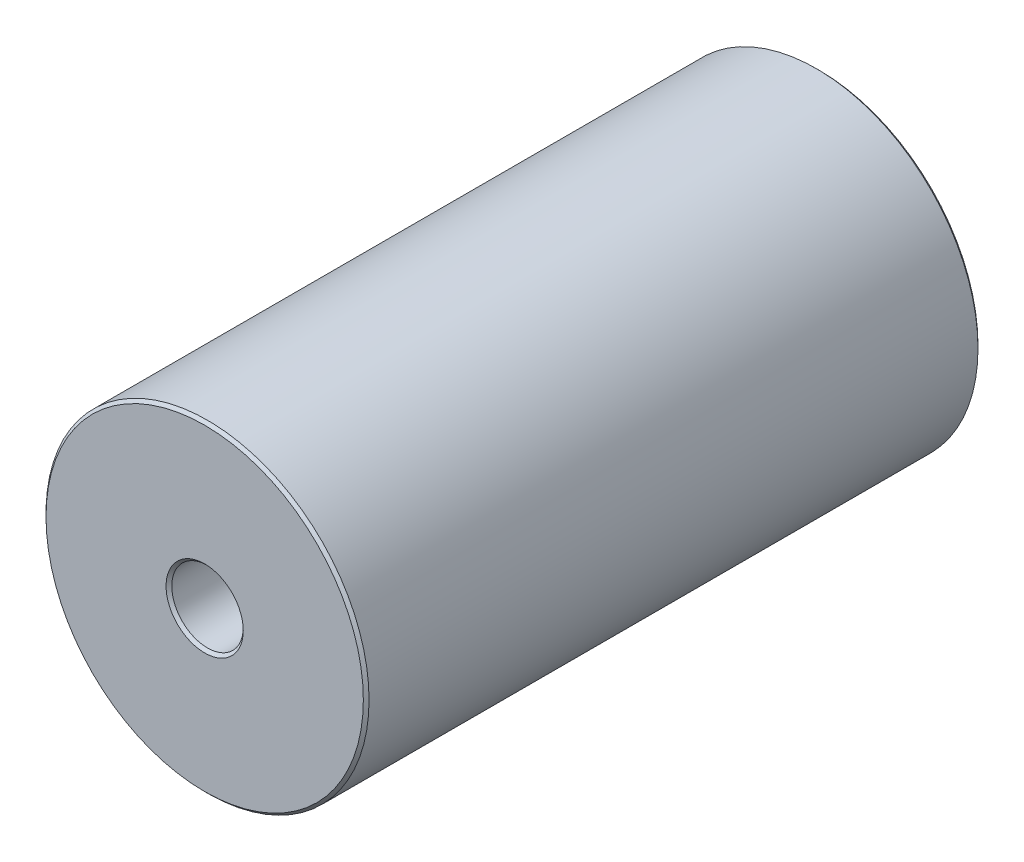
ISO-10303-21;
HEADER;
FILE_DESCRIPTION(('STEP AP214'),'2;1');
FILE_NAME('part.step','',(''),(''),'','','');
FILE_SCHEMA(('AUTOMOTIVE_DESIGN { 1 0 10303 214 1 1 1 1 }'));
ENDSEC;
DATA;
#1=APPLICATION_CONTEXT('core data for automotive mechanical design processes');
#2=APPLICATION_PROTOCOL_DEFINITION('international standard','automotive_design',2000,#1);
#3=PRODUCT_CONTEXT('',#1,'mechanical');
#4=PRODUCT('Part','Part','',(#3));
#5=PRODUCT_RELATED_PRODUCT_CATEGORY('part','',(#4));
#6=PRODUCT_DEFINITION_FORMATION('','',#4);
#7=PRODUCT_DEFINITION_CONTEXT('part definition',#1,'design');
#8=PRODUCT_DEFINITION('design','',#6,#7);
#9=PRODUCT_DEFINITION_SHAPE('','',#8);
#10=(LENGTH_UNIT() NAMED_UNIT(*) SI_UNIT(.MILLI.,.METRE.));
#11=(NAMED_UNIT(*) PLANE_ANGLE_UNIT() SI_UNIT($,.RADIAN.));
#12=(NAMED_UNIT(*) SI_UNIT($,.STERADIAN.) SOLID_ANGLE_UNIT());
#13=UNCERTAINTY_MEASURE_WITH_UNIT(LENGTH_MEASURE(1.E-05),#10,'distance_accuracy_value','');
#14=(GEOMETRIC_REPRESENTATION_CONTEXT(3) GLOBAL_UNCERTAINTY_ASSIGNED_CONTEXT((#13)) GLOBAL_UNIT_ASSIGNED_CONTEXT((#10,
#11,#12)) REPRESENTATION_CONTEXT('',''));
#15=CARTESIAN_POINT('',(0.,0.,0.));
#16=DIRECTION('',(0.,0.,1.));
#17=DIRECTION('',(1.,0.,0.));
#18=AXIS2_PLACEMENT_3D('',#15,#16,#17);
#19=CARTESIAN_POINT('',(0.,0.,54.61));
#20=DIRECTION('',(0.,0.,1.));
#21=DIRECTION('',(1.,0.,0.));
#22=AXIS2_PLACEMENT_3D('',#19,#20,#21);
#23=PLANE('',#22);
#24=CARTESIAN_POINT('',(0.,0.,54.61));
#25=DIRECTION('',(0.,0.,1.));
#26=DIRECTION('',(1.,0.,0.));
#27=AXIS2_PLACEMENT_3D('',#24,#25,#26);
#28=CIRCLE('',#27,3.42899999999999);
#29=CARTESIAN_POINT('',(3.42899999999999,0.,54.61));
#30=VERTEX_POINT('',#29);
#31=EDGE_CURVE('E10',#30,#30,#28,.F.);
#32=ORIENTED_EDGE('',*,*,#31,.T.);
#33=EDGE_LOOP('',(#32));
#34=FACE_BOUND('',#33,.T.);
#35=CARTESIAN_POINT('',(0.,0.,54.61));
#36=DIRECTION('',(0.,0.,1.));
#37=DIRECTION('',(1.,0.,0.));
#38=AXIS2_PLACEMENT_3D('',#35,#36,#37);
#39=CIRCLE('',#38,14.097);
#40=CARTESIAN_POINT('',(14.097,0.,54.61));
#41=VERTEX_POINT('',#40);
#42=EDGE_CURVE('E37',#41,#41,#39,.T.);
#43=ORIENTED_EDGE('',*,*,#42,.T.);
#44=EDGE_LOOP('',(#43));
#45=FACE_BOUND('',#44,.T.);
#46=ADVANCED_FACE('F30',(#34,#45),#23,.T.);
#47=CARTESIAN_POINT('',(0.,0.,0.));
#48=DIRECTION('',(0.,0.,1.));
#49=DIRECTION('',(1.,0.,0.));
#50=AXIS2_PLACEMENT_3D('',#47,#48,#49);
#51=PLANE('',#50);
#52=CARTESIAN_POINT('',(0.,0.,0.));
#53=DIRECTION('',(0.,0.,1.));
#54=DIRECTION('',(1.,0.,0.));
#55=AXIS2_PLACEMENT_3D('',#52,#53,#54);
#56=CIRCLE('',#55,3.42900000000001);
#57=CARTESIAN_POINT('',(3.42900000000001,0.,0.));
#58=VERTEX_POINT('',#57);
#59=EDGE_CURVE('E56',#58,#58,#56,.T.);
#60=ORIENTED_EDGE('',*,*,#59,.T.);
#61=EDGE_LOOP('',(#60));
#62=FACE_BOUND('',#61,.T.);
#63=CARTESIAN_POINT('',(0.,0.,0.));
#64=DIRECTION('',(0.,0.,1.));
#65=DIRECTION('',(1.,0.,0.));
#66=AXIS2_PLACEMENT_3D('',#63,#64,#65);
#67=CIRCLE('',#66,14.097);
#68=CARTESIAN_POINT('',(14.097,0.,0.));
#69=VERTEX_POINT('',#68);
#70=EDGE_CURVE('E59',#69,#69,#67,.F.);
#71=ORIENTED_EDGE('',*,*,#70,.T.);
#72=EDGE_LOOP('',(#71));
#73=FACE_BOUND('',#72,.T.);
#74=ADVANCED_FACE('F63',(#62,#73),#51,.F.);
#75=CARTESIAN_POINT('',(0.,0.,54.61));
#76=DIRECTION('',(0.,0.,-1.));
#77=DIRECTION('',(-1.,0.,0.));
#78=AXIS2_PLACEMENT_3D('',#75,#76,#77);
#79=CYLINDRICAL_SURFACE('',#78,14.351);
#80=CARTESIAN_POINT('',(0.,0.,0.253999999999997));
#81=DIRECTION('',(0.,0.,1.));
#82=DIRECTION('',(1.,0.,0.));
#83=AXIS2_PLACEMENT_3D('',#80,#81,#82);
#84=CIRCLE('',#83,14.351);
#85=CARTESIAN_POINT('',(14.351,0.,0.253999999999997));
#86=VERTEX_POINT('',#85);
#87=EDGE_CURVE('E41',#86,#86,#84,.T.);
#88=ORIENTED_EDGE('',*,*,#87,.T.);
#89=EDGE_LOOP('',(#88));
#90=FACE_BOUND('',#89,.T.);
#91=CARTESIAN_POINT('',(0.,0.,54.356));
#92=DIRECTION('',(0.,0.,1.));
#93=DIRECTION('',(1.,0.,0.));
#94=AXIS2_PLACEMENT_3D('',#91,#92,#93);
#95=CIRCLE('',#94,14.351);
#96=CARTESIAN_POINT('',(14.351,0.,54.356));
#97=VERTEX_POINT('',#96);
#98=EDGE_CURVE('E45',#97,#97,#95,.F.);
#99=ORIENTED_EDGE('',*,*,#98,.T.);
#100=EDGE_LOOP('',(#99));
#101=FACE_BOUND('',#100,.T.);
#102=ADVANCED_FACE('F73',(#90,#101),#79,.T.);
#103=CARTESIAN_POINT('',(0.,0.,54.61));
#104=DIRECTION('',(0.,0.,-1.));
#105=DIRECTION('',(-1.,0.,0.));
#106=AXIS2_PLACEMENT_3D('',#103,#104,#105);
#107=CYLINDRICAL_SURFACE('',#106,3.175);
#108=CARTESIAN_POINT('',(0.,0.,0.254000000000004));
#109=DIRECTION('',(0.,0.,1.));
#110=DIRECTION('',(1.,0.,0.));
#111=AXIS2_PLACEMENT_3D('',#108,#109,#110);
#112=CIRCLE('',#111,3.175);
#113=CARTESIAN_POINT('',(3.175,0.,0.254000000000004));
#114=VERTEX_POINT('',#113);
#115=EDGE_CURVE('E50',#114,#114,#112,.F.);
#116=ORIENTED_EDGE('',*,*,#115,.T.);
#117=EDGE_LOOP('',(#116));
#118=FACE_BOUND('',#117,.T.);
#119=CARTESIAN_POINT('',(0.,0.,54.356));
#120=DIRECTION('',(0.,0.,1.));
#121=DIRECTION('',(1.,0.,0.));
#122=AXIS2_PLACEMENT_3D('',#119,#120,#121);
#123=CIRCLE('',#122,3.175);
#124=CARTESIAN_POINT('',(3.175,0.,54.356));
#125=VERTEX_POINT('',#124);
#126=EDGE_CURVE('E53',#125,#125,#123,.T.);
#127=ORIENTED_EDGE('',*,*,#126,.T.);
#128=EDGE_LOOP('',(#127));
#129=FACE_BOUND('',#128,.T.);
#130=ADVANCED_FACE('F76',(#118,#129),#107,.F.);
#131=CARTESIAN_POINT('',(0.,0.,0.));
#132=DIRECTION('',(0.,0.,-1.));
#133=DIRECTION('',(-1.,0.,0.));
#134=AXIS2_PLACEMENT_3D('',#131,#132,#133);
#135=CONICAL_SURFACE('',#134,3.42900000000001,0.785398163397457);
#136=ORIENTED_EDGE('',*,*,#115,.F.);
#137=EDGE_LOOP('',(#136));
#138=FACE_BOUND('',#137,.T.);
#139=ORIENTED_EDGE('',*,*,#59,.F.);
#140=EDGE_LOOP('',(#139));
#141=FACE_BOUND('',#140,.T.);
#142=ADVANCED_FACE('F69',(#138,#141),#135,.F.);
#143=CARTESIAN_POINT('',(0.,0.,0.253999999999997));
#144=DIRECTION('',(0.,0.,1.));
#145=DIRECTION('',(1.,0.,0.));
#146=AXIS2_PLACEMENT_3D('',#143,#144,#145);
#147=CONICAL_SURFACE('',#146,14.351,0.785398163397455);
#148=ORIENTED_EDGE('',*,*,#70,.F.);
#149=EDGE_LOOP('',(#148));
#150=FACE_BOUND('',#149,.T.);
#151=ORIENTED_EDGE('',*,*,#87,.F.);
#152=EDGE_LOOP('',(#151));
#153=FACE_BOUND('',#152,.T.);
#154=ADVANCED_FACE('F65',(#150,#153),#147,.T.);
#155=CARTESIAN_POINT('',(0.,0.,54.356));
#156=DIRECTION('',(0.,0.,1.));
#157=DIRECTION('',(1.,0.,0.));
#158=AXIS2_PLACEMENT_3D('',#155,#156,#157);
#159=CONICAL_SURFACE('',#158,3.175,0.785398163397443);
#160=ORIENTED_EDGE('',*,*,#31,.F.);
#161=EDGE_LOOP('',(#160));
#162=FACE_BOUND('',#161,.T.);
#163=ORIENTED_EDGE('',*,*,#126,.F.);
#164=EDGE_LOOP('',(#163));
#165=FACE_BOUND('',#164,.T.);
#166=ADVANCED_FACE('F68',(#162,#165),#159,.F.);
#167=CARTESIAN_POINT('',(0.,0.,54.61));
#168=DIRECTION('',(0.,0.,-1.));
#169=DIRECTION('',(-1.,0.,0.));
#170=AXIS2_PLACEMENT_3D('',#167,#168,#169);
#171=CONICAL_SURFACE('',#170,14.097,0.785398163397465);
#172=ORIENTED_EDGE('',*,*,#98,.F.);
#173=EDGE_LOOP('',(#172));
#174=FACE_BOUND('',#173,.T.);
#175=ORIENTED_EDGE('',*,*,#42,.F.);
#176=EDGE_LOOP('',(#175));
#177=FACE_BOUND('',#176,.T.);
#178=ADVANCED_FACE('F32',(#174,#177),#171,.T.);
#179=CLOSED_SHELL('',(#46,#74,#102,#130,#142,#154,#166,#178));
#180=MANIFOLD_SOLID_BREP('B2',#179);
#181=ADVANCED_BREP_SHAPE_REPRESENTATION('',(#18,#180),#14);
#182=SHAPE_DEFINITION_REPRESENTATION(#9,#181);
ENDSEC;
END-ISO-10303-21;
